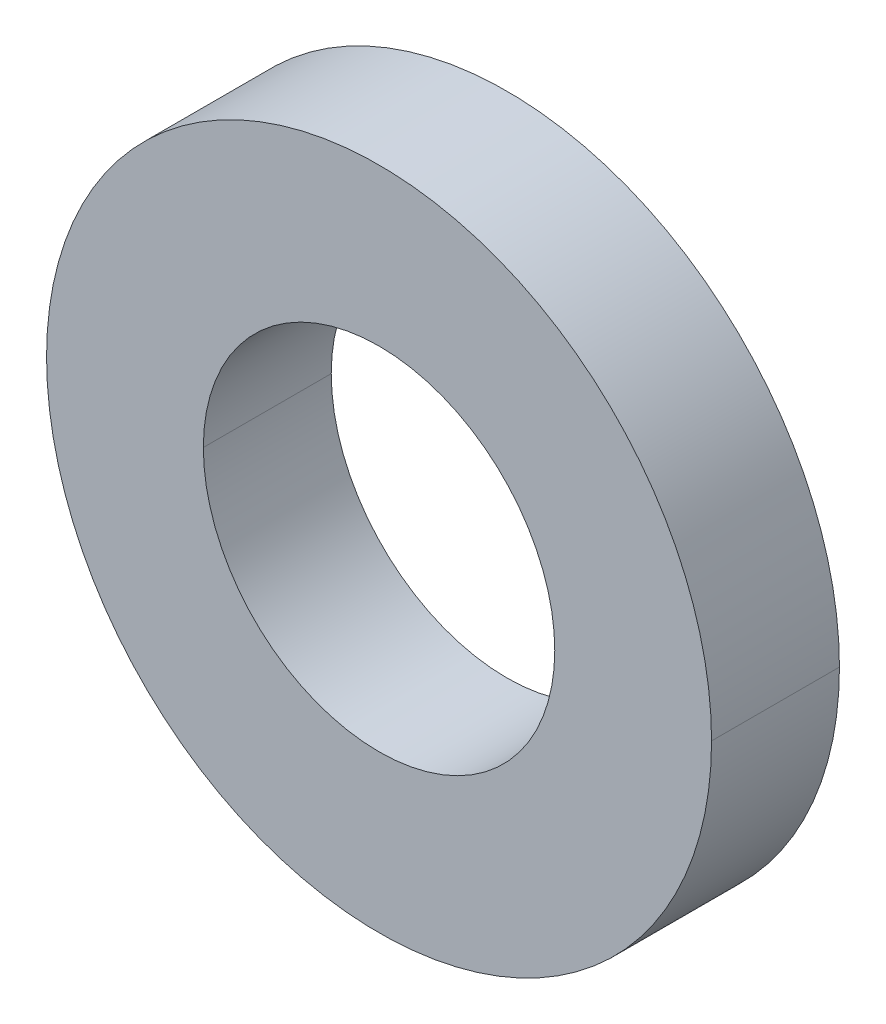
ISO-10303-21;
HEADER;
FILE_DESCRIPTION(('STEP AP214'),'2;1');
FILE_NAME('part.step','',(''),(''),'','','');
FILE_SCHEMA(('AUTOMOTIVE_DESIGN { 1 0 10303 214 1 1 1 1 }'));
ENDSEC;
DATA;
#1=APPLICATION_CONTEXT('core data for automotive mechanical design processes');
#2=APPLICATION_PROTOCOL_DEFINITION('international standard','automotive_design',2000,#1);
#3=PRODUCT_CONTEXT('',#1,'mechanical');
#4=PRODUCT('Part','Part','',(#3));
#5=PRODUCT_RELATED_PRODUCT_CATEGORY('part','',(#4));
#6=PRODUCT_DEFINITION_FORMATION('','',#4);
#7=PRODUCT_DEFINITION_CONTEXT('part definition',#1,'design');
#8=PRODUCT_DEFINITION('design','',#6,#7);
#9=PRODUCT_DEFINITION_SHAPE('','',#8);
#10=(LENGTH_UNIT() NAMED_UNIT(*) SI_UNIT(.MILLI.,.METRE.));
#11=(NAMED_UNIT(*) PLANE_ANGLE_UNIT() SI_UNIT($,.RADIAN.));
#12=(NAMED_UNIT(*) SI_UNIT($,.STERADIAN.) SOLID_ANGLE_UNIT());
#13=UNCERTAINTY_MEASURE_WITH_UNIT(LENGTH_MEASURE(1.E-05),#10,'distance_accuracy_value','');
#14=(GEOMETRIC_REPRESENTATION_CONTEXT(3) GLOBAL_UNCERTAINTY_ASSIGNED_CONTEXT((#13)) GLOBAL_UNIT_ASSIGNED_CONTEXT((#10,
#11,#12)) REPRESENTATION_CONTEXT('',''));
#15=CARTESIAN_POINT('',(0.,0.,0.));
#16=DIRECTION('',(0.,0.,1.));
#17=DIRECTION('',(1.,0.,0.));
#18=AXIS2_PLACEMENT_3D('',#15,#16,#17);
#19=CARTESIAN_POINT('',(0.,0.,1.25));
#20=DIRECTION('',(0.,0.,-1.));
#21=DIRECTION('',(0.,1.,0.));
#22=AXIS2_PLACEMENT_3D('',#19,#20,#21);
#23=CYLINDRICAL_SURFACE('',#22,3.435);
#24=DIRECTION('',(0.,0.,-1.));
#25=VECTOR('',#24,1.);
#26=CARTESIAN_POINT('',(3.435,0.,1.25));
#27=LINE('',#26,#25);
#28=CARTESIAN_POINT('',(3.435,0.,1.25));
#29=VERTEX_POINT('',#28);
#30=CARTESIAN_POINT('',(3.435,0.,-1.25));
#31=VERTEX_POINT('',#30);
#32=EDGE_CURVE('E11',#29,#31,#27,.T.);
#33=ORIENTED_EDGE('',*,*,#32,.T.);
#34=CARTESIAN_POINT('',(0.,0.,-1.25));
#35=DIRECTION('',(0.,0.,1.));
#36=DIRECTION('',(1.,0.,0.));
#37=AXIS2_PLACEMENT_3D('',#34,#35,#36);
#38=CIRCLE('',#37,3.435);
#39=CARTESIAN_POINT('',(-3.435,0.,-1.25));
#40=VERTEX_POINT('',#39);
#41=EDGE_CURVE('E25',#40,#31,#38,.T.);
#42=ORIENTED_EDGE('',*,*,#41,.F.);
#43=DIRECTION('',(0.,0.,-1.));
#44=VECTOR('',#43,1.);
#45=CARTESIAN_POINT('',(-3.435,0.,1.25));
#46=LINE('',#45,#44);
#47=CARTESIAN_POINT('',(-3.435,0.,1.25));
#48=VERTEX_POINT('',#47);
#49=EDGE_CURVE('E94',#48,#40,#46,.T.);
#50=ORIENTED_EDGE('',*,*,#49,.F.);
#51=CARTESIAN_POINT('',(0.,0.,1.25));
#52=DIRECTION('',(0.,0.,1.));
#53=DIRECTION('',(1.,0.,0.));
#54=AXIS2_PLACEMENT_3D('',#51,#52,#53);
#55=CIRCLE('',#54,3.435);
#56=EDGE_CURVE('E90',#48,#29,#55,.T.);
#57=ORIENTED_EDGE('',*,*,#56,.T.);
#58=EDGE_LOOP('',(#33,#42,#50,#57));
#59=FACE_BOUND('',#58,.T.);
#60=ADVANCED_FACE('F17',(#59),#23,.F.);
#61=CARTESIAN_POINT('',(0.,0.,1.25));
#62=DIRECTION('',(0.,0.,1.));
#63=DIRECTION('',(1.,0.,0.));
#64=AXIS2_PLACEMENT_3D('',#61,#62,#63);
#65=PLANE('',#64);
#66=ORIENTED_EDGE('',*,*,#56,.F.);
#67=CARTESIAN_POINT('',(0.,0.,1.25));
#68=DIRECTION('',(0.,0.,1.));
#69=DIRECTION('',(1.,0.,0.));
#70=AXIS2_PLACEMENT_3D('',#67,#68,#69);
#71=CIRCLE('',#70,3.435);
#72=EDGE_CURVE('E85',#29,#48,#71,.T.);
#73=ORIENTED_EDGE('',*,*,#72,.F.);
#74=EDGE_LOOP('',(#66,#73));
#75=FACE_BOUND('',#74,.T.);
#76=CARTESIAN_POINT('',(0.,0.,1.25));
#77=DIRECTION('',(0.,0.,1.));
#78=DIRECTION('',(1.,0.,0.));
#79=AXIS2_PLACEMENT_3D('',#76,#77,#78);
#80=CIRCLE('',#79,6.5);
#81=CARTESIAN_POINT('',(6.5,0.,1.25));
#82=VERTEX_POINT('',#81);
#83=CARTESIAN_POINT('',(-6.5,0.,1.25));
#84=VERTEX_POINT('',#83);
#85=EDGE_CURVE('E72',#82,#84,#80,.T.);
#86=ORIENTED_EDGE('',*,*,#85,.T.);
#87=CARTESIAN_POINT('',(0.,0.,1.25));
#88=DIRECTION('',(0.,0.,1.));
#89=DIRECTION('',(1.,0.,0.));
#90=AXIS2_PLACEMENT_3D('',#87,#88,#89);
#91=CIRCLE('',#90,6.5);
#92=EDGE_CURVE('E73',#84,#82,#91,.T.);
#93=ORIENTED_EDGE('',*,*,#92,.T.);
#94=EDGE_LOOP('',(#86,#93));
#95=FACE_BOUND('',#94,.T.);
#96=ADVANCED_FACE('F116',(#75,#95),#65,.T.);
#97=CARTESIAN_POINT('',(0.,0.,1.25));
#98=DIRECTION('',(0.,0.,-1.));
#99=DIRECTION('',(0.,1.,0.));
#100=AXIS2_PLACEMENT_3D('',#97,#98,#99);
#101=CYLINDRICAL_SURFACE('',#100,6.5);
#102=DIRECTION('',(0.,0.,-1.));
#103=VECTOR('',#102,1.);
#104=CARTESIAN_POINT('',(6.5,0.,1.25));
#105=LINE('',#104,#103);
#106=CARTESIAN_POINT('',(6.5,0.,-1.25));
#107=VERTEX_POINT('',#106);
#108=EDGE_CURVE('E59',#82,#107,#105,.T.);
#109=ORIENTED_EDGE('',*,*,#108,.F.);
#110=ORIENTED_EDGE('',*,*,#92,.F.);
#111=DIRECTION('',(0.,0.,-1.));
#112=VECTOR('',#111,1.);
#113=CARTESIAN_POINT('',(-6.5,0.,1.25));
#114=LINE('',#113,#112);
#115=CARTESIAN_POINT('',(-6.5,0.,-1.25));
#116=VERTEX_POINT('',#115);
#117=EDGE_CURVE('E61',#84,#116,#114,.T.);
#118=ORIENTED_EDGE('',*,*,#117,.T.);
#119=CARTESIAN_POINT('',(0.,0.,-1.25));
#120=DIRECTION('',(0.,0.,1.));
#121=DIRECTION('',(1.,0.,0.));
#122=AXIS2_PLACEMENT_3D('',#119,#120,#121);
#123=CIRCLE('',#122,6.5);
#124=EDGE_CURVE('E54',#116,#107,#123,.T.);
#125=ORIENTED_EDGE('',*,*,#124,.T.);
#126=EDGE_LOOP('',(#109,#110,#118,#125));
#127=FACE_BOUND('',#126,.T.);
#128=ADVANCED_FACE('F56',(#127),#101,.T.);
#129=CARTESIAN_POINT('',(0.,0.,-1.25));
#130=DIRECTION('',(0.,0.,1.));
#131=DIRECTION('',(1.,0.,0.));
#132=AXIS2_PLACEMENT_3D('',#129,#130,#131);
#133=PLANE('',#132);
#134=CARTESIAN_POINT('',(0.,0.,-1.25));
#135=DIRECTION('',(0.,0.,1.));
#136=DIRECTION('',(1.,0.,0.));
#137=AXIS2_PLACEMENT_3D('',#134,#135,#136);
#138=CIRCLE('',#137,3.435);
#139=EDGE_CURVE('E64',#31,#40,#138,.T.);
#140=ORIENTED_EDGE('',*,*,#139,.T.);
#141=ORIENTED_EDGE('',*,*,#41,.T.);
#142=EDGE_LOOP('',(#140,#141));
#143=FACE_BOUND('',#142,.T.);
#144=ORIENTED_EDGE('',*,*,#124,.F.);
#145=CARTESIAN_POINT('',(0.,0.,-1.25));
#146=DIRECTION('',(0.,0.,1.));
#147=DIRECTION('',(1.,0.,0.));
#148=AXIS2_PLACEMENT_3D('',#145,#146,#147);
#149=CIRCLE('',#148,6.5);
#150=EDGE_CURVE('E66',#107,#116,#149,.T.);
#151=ORIENTED_EDGE('',*,*,#150,.F.);
#152=EDGE_LOOP('',(#144,#151));
#153=FACE_BOUND('',#152,.T.);
#154=ADVANCED_FACE('F67',(#143,#153),#133,.F.);
#155=CARTESIAN_POINT('',(0.,0.,1.25));
#156=DIRECTION('',(0.,0.,-1.));
#157=DIRECTION('',(0.,-1.,0.));
#158=AXIS2_PLACEMENT_3D('',#155,#156,#157);
#159=CYLINDRICAL_SURFACE('',#158,6.5);
#160=ORIENTED_EDGE('',*,*,#108,.T.);
#161=ORIENTED_EDGE('',*,*,#150,.T.);
#162=ORIENTED_EDGE('',*,*,#117,.F.);
#163=ORIENTED_EDGE('',*,*,#85,.F.);
#164=EDGE_LOOP('',(#160,#161,#162,#163));
#165=FACE_BOUND('',#164,.T.);
#166=ADVANCED_FACE('F71',(#165),#159,.T.);
#167=CARTESIAN_POINT('',(0.,0.,1.25));
#168=DIRECTION('',(0.,0.,-1.));
#169=DIRECTION('',(0.,-1.,0.));
#170=AXIS2_PLACEMENT_3D('',#167,#168,#169);
#171=CYLINDRICAL_SURFACE('',#170,3.435);
#172=ORIENTED_EDGE('',*,*,#32,.F.);
#173=ORIENTED_EDGE('',*,*,#72,.T.);
#174=ORIENTED_EDGE('',*,*,#49,.T.);
#175=ORIENTED_EDGE('',*,*,#139,.F.);
#176=EDGE_LOOP('',(#172,#173,#174,#175));
#177=FACE_BOUND('',#176,.T.);
#178=ADVANCED_FACE('F112',(#177),#171,.F.);
#179=CLOSED_SHELL('',(#60,#96,#128,#154,#166,#178));
#180=MANIFOLD_SOLID_BREP('B1',#179);
#181=ADVANCED_BREP_SHAPE_REPRESENTATION('',(#18,#180),#14);
#182=SHAPE_DEFINITION_REPRESENTATION(#9,#181);
ENDSEC;
END-ISO-10303-21;
